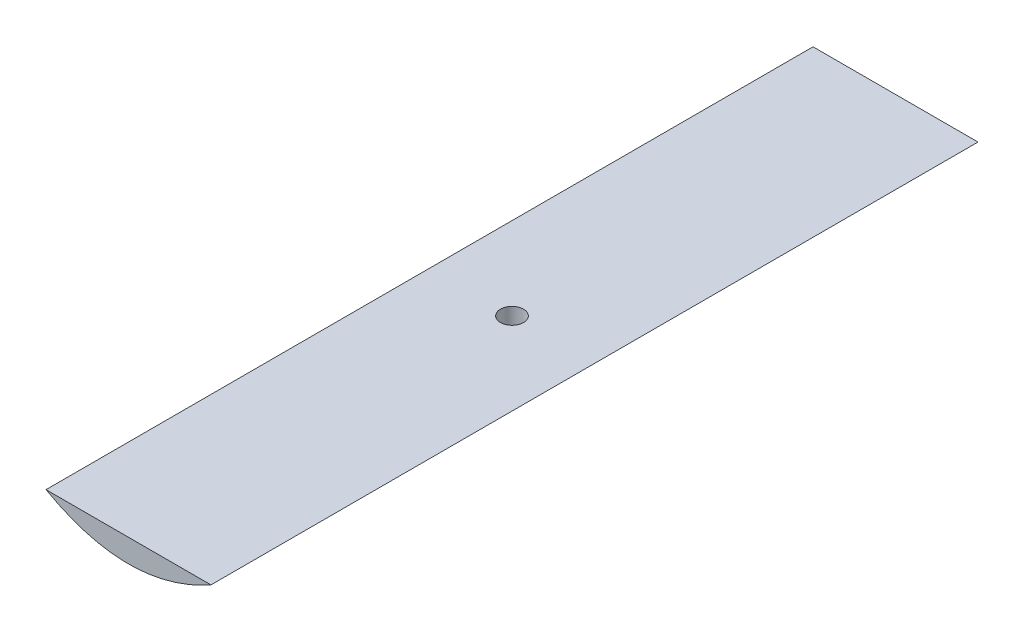
ISO-10303-21;
HEADER;
FILE_DESCRIPTION(('STEP AP214'),'2;1');
FILE_NAME('part.step','',(''),(''),'','','');
FILE_SCHEMA(('AUTOMOTIVE_DESIGN { 1 0 10303 214 1 1 1 1 }'));
ENDSEC;
DATA;
#1=APPLICATION_CONTEXT('core data for automotive mechanical design processes');
#2=APPLICATION_PROTOCOL_DEFINITION('international standard','automotive_design',2000,#1);
#3=PRODUCT_CONTEXT('',#1,'mechanical');
#4=PRODUCT('Part','Part','',(#3));
#5=PRODUCT_RELATED_PRODUCT_CATEGORY('part','',(#4));
#6=PRODUCT_DEFINITION_FORMATION('','',#4);
#7=PRODUCT_DEFINITION_CONTEXT('part definition',#1,'design');
#8=PRODUCT_DEFINITION('design','',#6,#7);
#9=PRODUCT_DEFINITION_SHAPE('','',#8);
#10=(LENGTH_UNIT() NAMED_UNIT(*) SI_UNIT(.MILLI.,.METRE.));
#11=(NAMED_UNIT(*) PLANE_ANGLE_UNIT() SI_UNIT($,.RADIAN.));
#12=(NAMED_UNIT(*) SI_UNIT($,.STERADIAN.) SOLID_ANGLE_UNIT());
#13=UNCERTAINTY_MEASURE_WITH_UNIT(LENGTH_MEASURE(1.E-05),#10,'distance_accuracy_value','');
#14=(GEOMETRIC_REPRESENTATION_CONTEXT(3) GLOBAL_UNCERTAINTY_ASSIGNED_CONTEXT((#13)) GLOBAL_UNIT_ASSIGNED_CONTEXT((#10,
#11,#12)) REPRESENTATION_CONTEXT('',''));
#15=CARTESIAN_POINT('',(0.,0.,0.));
#16=DIRECTION('',(0.,0.,1.));
#17=DIRECTION('',(1.,0.,0.));
#18=AXIS2_PLACEMENT_3D('',#15,#16,#17);
#19=CARTESIAN_POINT('',(-127.000000000214,127.000000000428,331.382));
#20=CARTESIAN_POINT('',(-3.79340656109228E-11,-127.000000000353,331.382));
#21=CARTESIAN_POINT('',(127.000000000138,127.000000000277,331.382));
#22=B_SPLINE_CURVE_WITH_KNOTS('',2,(#19,#20,#21),.UNSPECIFIED.,.F.,.F.,(3,3),
(0.0560283962320779,0.943971603767657),.UNSPECIFIED.);
#23=DIRECTION('',(0.,0.,-1.));
#24=VECTOR('',#23,1.);
#25=SURFACE_OF_LINEAR_EXTRUSION('',#22,#24);
#26=CARTESIAN_POINT('',(-3.8666986279523E-11,0.,170.691));
#27=CARTESIAN_POINT('',(0.140243418776108,-2.6699305172424E-07,170.691001231433));
#28=CARTESIAN_POINT('',(0.280467525237042,0.000465562516940687,170.685097230984));
#29=CARTESIAN_POINT('',(0.559962595063275,0.00231523587437549,170.661524046872));
#30=CARTESIAN_POINT('',(0.699233312636911,0.00369930806766296,170.643851936745));
#31=CARTESIAN_POINT('',(0.975897753678727,0.00734818817902314,170.596846553818));
#32=CARTESIAN_POINT('',(1.11328981478552,0.00961372970035764,170.56750356747));
#33=CARTESIAN_POINT('',(1.38515426852992,0.0149619507509379,170.497356400755));
#34=CARTESIAN_POINT('',(1.5196255738456,0.0180449291352847,170.456548028314));
#35=CARTESIAN_POINT('',(1.78451787567308,0.0249368185981995,170.363811791102));
#36=CARTESIAN_POINT('',(1.91494251092554,0.0287450541534105,170.311894268167));
#37=CARTESIAN_POINT('',(2.17099762711855,0.0369829254037339,170.197268116185));
#38=CARTESIAN_POINT('',(2.29662632225176,0.0414127897511894,170.134555514476));
#39=CARTESIAN_POINT('',(2.54208015035429,0.0507646918339267,169.998839784442));
#40=CARTESIAN_POINT('',(2.66190866062418,0.0556864379148631,169.925842743734));
#41=CARTESIAN_POINT('',(2.89504226039194,0.0658871980457952,169.770018962073));
#42=CARTESIAN_POINT('',(3.00834492019486,0.071166343591083,169.68718859468));
#43=CARTESIAN_POINT('',(3.22776531807338,0.0819402346027991,169.512159366714));
#44=CARTESIAN_POINT('',(3.33387079568423,0.0874353239752214,169.419945157102));
#45=CARTESIAN_POINT('',(3.53797985082088,0.0984793661946682,169.226878907786));
#46=CARTESIAN_POINT('',(3.63598042026635,0.104028338193645,169.126023689055));
#47=CARTESIAN_POINT('',(3.82311357234575,0.115019233076617,168.916450529071));
#48=CARTESIAN_POINT('',(3.91224902862397,0.120461190187785,168.807735155566));
#49=CARTESIAN_POINT('',(4.08108889468054,0.131087830094054,168.583137354757));
#50=CARTESIAN_POINT('',(4.1607898115851,0.136272417195219,168.467252297105));
#51=CARTESIAN_POINT('',(4.31022521240846,0.146239769918813,168.229058992093));
#52=CARTESIAN_POINT('',(4.37995042878405,0.151022160217652,168.106744914469));
#53=CARTESIAN_POINT('',(4.50887230569179,0.160045436635679,167.856611914746));
#54=CARTESIAN_POINT('',(4.56806506178813,0.164286121778395,167.728790972945));
#55=CARTESIAN_POINT('',(4.67544406310053,0.172101519356614,167.468643348392));
#56=CARTESIAN_POINT('',(4.72363450571177,0.175676485668325,167.336318406135));
#57=CARTESIAN_POINT('',(4.80870605794444,0.182061768738799,167.06801238023));
#58=CARTESIAN_POINT('',(4.84558299658507,0.184871803445185,166.93202996822));
#59=CARTESIAN_POINT('',(4.90765760390563,0.18963883535412,166.657751261876));
#60=CARTESIAN_POINT('',(4.9328837080034,0.191597908737746,166.519461463822));
#61=CARTESIAN_POINT('',(4.97162121814531,0.194619484385594,166.241227113128));
#62=CARTESIAN_POINT('',(4.98512829820605,0.195681655561715,166.101281968738));
#63=CARTESIAN_POINT('',(5.00785028255985,0.197465261504826,165.680568740317));
#64=CARTESIAN_POINT('',(4.99933435425245,0.196789176377217,165.398619297601));
#65=CARTESIAN_POINT('',(4.93519466446421,0.191773289877744,164.840956512123));
#66=CARTESIAN_POINT('',(4.87967550964054,0.187441624144494,164.565230716333));
#67=CARTESIAN_POINT('',(4.72329742511955,0.175617781650834,164.026982407948));
#68=CARTESIAN_POINT('',(4.62243809801755,0.168125577188474,163.764460011104));
#69=CARTESIAN_POINT('',(4.37811755304827,0.150811439286074,163.259788491915));
#70=CARTESIAN_POINT('',(4.23460933280636,0.14098693789068,163.017662227523));
#71=CARTESIAN_POINT('',(3.90910081484108,0.120115482975406,162.560891810831));
#72=CARTESIAN_POINT('',(3.72709982298985,0.109068507412754,162.346248154228));
#73=CARTESIAN_POINT('',(3.32918322893821,0.0869595663502635,161.949930081972));
#74=CARTESIAN_POINT('',(3.11317700776928,0.0758976414218899,161.768346638056));
#75=CARTESIAN_POINT('',(2.6536981102666,0.0550348333427399,161.444005182733));
#76=CARTESIAN_POINT('',(2.41022541724305,0.0452339509582345,161.301247194917));
#77=CARTESIAN_POINT('',(1.90266457040486,0.0279984114823269,161.058614480152));
#78=CARTESIAN_POINT('',(1.63857440492174,0.0205639856487961,160.958743943971));
#79=CARTESIAN_POINT('',(1.09730317990273,0.00890462123123609,160.804785603792));
#80=CARTESIAN_POINT('',(0.820122364217823,0.00467962288742488,160.750696947328));
#81=CARTESIAN_POINT('',(0.261330002917575,-7.51403248485056E-05,160.689951970638));
#82=CARTESIAN_POINT('',(-0.0202677417834046,-0.000614738160187065,160.683169432574));
#83=CARTESIAN_POINT('',(-0.580596422133503,0.00203614659788219,160.716898777606));
#84=CARTESIAN_POINT('',(-0.859327381489082,0.00522659832113232,160.757410269294));
#85=CARTESIAN_POINT('',(-1.40565044844913,0.0149707424967937,160.884472916647));
#86=CARTESIAN_POINT('',(-1.67325625214006,0.0215201587106409,160.970965539651));
#87=CARTESIAN_POINT('',(-2.19015653473811,0.0372434568118303,161.187475405468));
#88=CARTESIAN_POINT('',(-2.43945075247467,0.0464173761222406,161.317493268917));
#89=CARTESIAN_POINT('',(-2.91322808002541,0.0663825060716991,161.617683087982));
#90=CARTESIAN_POINT('',(-3.13765781918519,0.0771770828180645,161.787939051032));
#91=CARTESIAN_POINT('',(-3.55479654863162,0.0991573479486632,162.163646792544));
#92=CARTESIAN_POINT('',(-3.74750504999585,0.110343042358009,162.36909911339));
#93=CARTESIAN_POINT('',(-4.09616256899048,0.131873970029107,162.809927520824));
#94=CARTESIAN_POINT('',(-4.25202950242808,0.142217293498592,163.045368661827));
#95=CARTESIAN_POINT('',(-4.52201338280188,0.16086864532871,163.539114121048));
#96=CARTESIAN_POINT('',(-4.63613070900519,0.169176692178236,163.797418231546));
#97=CARTESIAN_POINT('',(-4.81924759478122,0.182808265057976,164.329459419444));
#98=CARTESIAN_POINT('',(-4.88829797247574,0.188135151716316,164.603178734632));
#99=CARTESIAN_POINT('',(-4.95667946438499,0.193450859053268,165.019287994346));
#100=CARTESIAN_POINT('',(-4.97360724013074,0.194776983593156,165.15898854501));
#101=CARTESIAN_POINT('',(-4.99563611124138,0.196505744824291,165.439310600866));
#102=CARTESIAN_POINT('',(-5.00074160508297,0.196908724970557,165.579931744018));
#103=CARTESIAN_POINT('',(-4.99908613476319,0.196778498611664,165.860764356471));
#104=CARTESIAN_POINT('',(-4.9923529142798,0.196247480901902,166.000976014337));
#105=CARTESIAN_POINT('',(-4.96713178478163,0.194269587875403,166.280281755162));
#106=CARTESIAN_POINT('',(-4.94864822935825,0.192823051766303,166.419376232725));
#107=CARTESIAN_POINT('',(-4.90005397006219,0.189054644695284,166.695559135993));
#108=CARTESIAN_POINT('',(-4.86993898436763,0.186732451389405,166.83264680363));
#109=CARTESIAN_POINT('',(-4.79831316837335,0.181279752096686,167.103741638904));
#110=CARTESIAN_POINT('',(-4.75680652118187,0.178149542844733,167.237749917779));
#111=CARTESIAN_POINT('',(-4.66267556826608,0.171167948629343,167.501832124425));
#112=CARTESIAN_POINT('',(-4.61004769869226,0.167316332532672,167.631904775693));
#113=CARTESIAN_POINT('',(-4.49408015230297,0.159003131731914,167.887105748433));
#114=CARTESIAN_POINT('',(-4.43074440693372,0.154541771013164,168.012235863854));
#115=CARTESIAN_POINT('',(-4.29377452107371,0.145132364420985,168.256764185106));
#116=CARTESIAN_POINT('',(-4.22013683366182,0.140184151100823,168.376160397675));
#117=CARTESIAN_POINT('',(-4.06313011081605,0.12994384602158,168.60829341564));
#118=CARTESIAN_POINT('',(-3.97976463762505,0.124651880454774,168.72103263614));
#119=CARTESIAN_POINT('',(-3.80360882238128,0.113855609181186,168.939430372674));
#120=CARTESIAN_POINT('',(-3.71079142443317,0.108350723569986,169.045067038573));
#121=CARTESIAN_POINT('',(-3.51662895713596,0.0973012660650058,169.248111922484));
#122=CARTESIAN_POINT('',(-3.41528702547247,0.0917567094547948,169.345523141868));
#123=CARTESIAN_POINT('',(-3.20469594928144,0.0807794109392042,169.531530255022));
#124=CARTESIAN_POINT('',(-3.09544200515702,0.0753467395158035,169.620120719233));
#125=CARTESIAN_POINT('',(-2.8698943461558,0.0647526218217907,169.78776005606));
#126=CARTESIAN_POINT('',(-2.75360324408777,0.0595910761991617,169.866812437803));
#127=CARTESIAN_POINT('',(-2.51451600059494,0.0496730195788078,170.015006366644));
#128=CARTESIAN_POINT('',(-2.39170682871411,0.0449173736033164,170.084126951929));
#129=CARTESIAN_POINT('',(-2.14072448719616,0.0359603178528859,170.211742374541));
#130=CARTESIAN_POINT('',(-2.01255330031871,0.0317587055529676,170.270241097615));
#131=CARTESIAN_POINT('',(-1.75182309414916,0.0240307807061436,170.376178494539));
#132=CARTESIAN_POINT('',(-1.61926789247816,0.0205038978632863,170.423626516121));
#133=CARTESIAN_POINT('',(-1.35065667957684,0.0142222909830544,170.507171734714));
#134=CARTESIAN_POINT('',(-1.21460156064564,0.011467372223445,170.543271794443));
#135=CARTESIAN_POINT('',(-0.900567784081527,0.0061405593548209,170.612554086596));
#136=CARTESIAN_POINT('',(-0.721734853520387,0.00384669906358009,170.641944324627));
#137=CARTESIAN_POINT('',(-0.361923895658573,0.000776593390433146,170.681166464188));
#138=CARTESIAN_POINT('',(-0.180945873343936,3.44481697017355E-07,170.690998411172));
#139=CARTESIAN_POINT('',(-3.8666986279523E-11,0.,170.691));
#140=B_SPLINE_CURVE_WITH_KNOTS('',3,(#26,#27,#28,#29,#30,#31,#32,#33,#34,#35,#36,#37,#38,#39,
#40,#41,#42,#43,#44,#45,#46,#47,#48,#49,#50,#51,#52,#53,#54,#55,#56,#57,#58,#59,#60,#61,#62,#63,
#64,#65,#66,#67,#68,#69,#70,#71,#72,#73,#74,#75,#76,#77,#78,#79,#80,#81,#82,#83,#84,#85,#86,#87,
#88,#89,#90,#91,#92,#93,#94,#95,#96,#97,#98,#99,#100,#101,#102,#103,#104,#105,#106,#107,#108,
#109,#110,#111,#112,#113,#114,#115,#116,#117,#118,#119,#120,#121,#122,#123,#124,#125,#126,#127,
#128,#129,#130,#131,#132,#133,#134,#135,#136,#137,#138,#139),.UNSPECIFIED.,.T.,.F.,(4,2,2,2,2,2,
2,2,2,2,2,2,2,2,2,2,2,2,2,2,2,2,2,2,2,2,2,2,2,2,2,2,2,2,2,2,2,2,2,2,2,2,2,2,2,2,2,2,2,2,2,2,2,2,
2,2,4),(0.,0.420572092113115,0.841248810058733,1.26227638788762,1.68345810624899,
2.10424942688823,2.52519593396708,2.94589431109778,3.36674832275209,3.78830213635377,
4.21001171108224,4.63158413919714,5.05331215776144,5.47542945739227,5.89770291348426,
6.31981500157106,6.74208252439412,7.16331392880732,7.5847007613269,8.42655257184845,
9.26653573388229,10.1065262584762,10.9474459723122,11.7883808514781,12.6315958646877,
13.4748113902733,14.3181092923571,15.1613914917853,16.0024228594873,16.8434472668026,
17.6834036287611,18.5233719683435,19.3651096964196,20.2068603970638,21.0504692299972,
21.8940703991216,22.7367186607014,23.1584915288086,23.5801074512068,24.0007366455998,
24.4212100843297,24.8418384576594,25.2623125791052,25.6829216484051,26.1033766231779,
26.5239767169669,26.9444232706403,27.3661091071582,27.7876404043232,28.2094295887173,
28.6310631176646,29.0535738611475,29.4759297266713,29.8979270152338,30.3198177620813,
30.8624525751247,31.4050861271186),.UNSPECIFIED.);
#141=CARTESIAN_POINT('',(-3.8666986279523E-11,0.,170.691));
#142=VERTEX_POINT('',#141);
#143=EDGE_CURVE('E67',#142,#142,#140,.T.);
#144=ORIENTED_EDGE('',*,*,#143,.T.);
#145=EDGE_LOOP('',(#144));
#146=FACE_BOUND('',#145,.T.);
#147=CARTESIAN_POINT('',(-35.6370593624671,9.99999999999999,331.382));
#148=VERTEX_POINT('',#147);
#149=CARTESIAN_POINT('',(35.6370593624671,9.99999999999999,331.382));
#150=VERTEX_POINT('',#149);
#151=EDGE_CURVE('E11',#148,#150,#22,.T.);
#152=ORIENTED_EDGE('',*,*,#151,.F.);
#153=DIRECTION('',(0.,0.,-1.));
#154=VECTOR('',#153,1.);
#155=CARTESIAN_POINT('',(-35.6370593624108,9.99999999999994,331.382));
#156=LINE('',#155,#154);
#157=CARTESIAN_POINT('',(-35.6370593624671,9.99999999999999,0.));
#158=VERTEX_POINT('',#157);
#159=EDGE_CURVE('E59',#148,#158,#156,.T.);
#160=ORIENTED_EDGE('',*,*,#159,.T.);
#161=CARTESIAN_POINT('',(-127.000000000214,127.000000000428,0.));
#162=CARTESIAN_POINT('',(-3.79340656109228E-11,-127.000000000353,0.));
#163=CARTESIAN_POINT('',(127.000000000138,127.000000000277,0.));
#164=B_SPLINE_CURVE_WITH_KNOTS('',2,(#161,#162,#163),.UNSPECIFIED.,.F.,.F.,(3,3),
(0.0560283962320779,0.943971603767657),.UNSPECIFIED.);
#165=CARTESIAN_POINT('',(35.6370593624671,10.0000000000315,0.));
#166=VERTEX_POINT('',#165);
#167=EDGE_CURVE('E43',#158,#166,#164,.T.);
#168=ORIENTED_EDGE('',*,*,#167,.T.);
#169=DIRECTION('',(0.,0.,-1.));
#170=VECTOR('',#169,1.);
#171=CARTESIAN_POINT('',(35.6370593624109,9.99999999999998,331.382));
#172=LINE('',#171,#170);
#173=EDGE_CURVE('E50',#166,#150,#172,.F.);
#174=ORIENTED_EDGE('',*,*,#173,.T.);
#175=EDGE_LOOP('',(#152,#160,#168,#174));
#176=FACE_BOUND('',#175,.T.);
#177=ADVANCED_FACE('F33',(#146,#176),#25,.F.);
#178=CARTESIAN_POINT('',(-3.79349329726608E-11,0.,331.382));
#179=DIRECTION('',(0.,0.,-1.));
#180=DIRECTION('',(-1.,0.,0.));
#181=AXIS2_PLACEMENT_3D('',#178,#179,#180);
#182=PLANE('',#181);
#183=ORIENTED_EDGE('',*,*,#151,.T.);
#184=DIRECTION('',(1.,0.,0.));
#185=VECTOR('',#184,1.);
#186=CARTESIAN_POINT('',(-130.,9.99999999999999,331.382));
#187=LINE('',#186,#185);
#188=EDGE_CURVE('E62',#148,#150,#187,.T.);
#189=ORIENTED_EDGE('',*,*,#188,.F.);
#190=EDGE_LOOP('',(#183,#189));
#191=FACE_BOUND('',#190,.T.);
#192=ADVANCED_FACE('F70',(#191),#182,.F.);
#193=CARTESIAN_POINT('',(-3.79349329726608E-11,0.,0.));
#194=DIRECTION('',(0.,0.,-1.));
#195=DIRECTION('',(-1.,0.,0.));
#196=AXIS2_PLACEMENT_3D('',#193,#194,#195);
#197=PLANE('',#196);
#198=DIRECTION('',(1.,0.,0.));
#199=VECTOR('',#198,1.);
#200=CARTESIAN_POINT('',(-130.,9.99999999999999,0.));
#201=LINE('',#200,#199);
#202=EDGE_CURVE('E54',#158,#166,#201,.T.);
#203=ORIENTED_EDGE('',*,*,#202,.T.);
#204=ORIENTED_EDGE('',*,*,#167,.F.);
#205=EDGE_LOOP('',(#203,#204));
#206=FACE_BOUND('',#205,.T.);
#207=ADVANCED_FACE('F88',(#206),#197,.T.);
#208=CARTESIAN_POINT('',(-3.86635168325711E-11,-3.79141162909491E-11,165.691));
#209=DIRECTION('',(0.,1.,0.));
#210=DIRECTION('',(0.,0.,1.));
#211=AXIS2_PLACEMENT_3D('',#208,#209,#210);
#212=CYLINDRICAL_SURFACE('',#211,5.);
#213=CARTESIAN_POINT('',(-3.86635168325711E-11,9.99999999999999,165.691));
#214=DIRECTION('',(0.,-1.,0.));
#215=DIRECTION('',(0.,0.,-1.));
#216=AXIS2_PLACEMENT_3D('',#213,#214,#215);
#217=CIRCLE('',#216,5.);
#218=CARTESIAN_POINT('',(-3.86635168325711E-11,9.99999999999999,160.691));
#219=VERTEX_POINT('',#218);
#220=EDGE_CURVE('E38',#219,#219,#217,.F.);
#221=ORIENTED_EDGE('',*,*,#220,.T.);
#222=EDGE_LOOP('',(#221));
#223=FACE_BOUND('',#222,.T.);
#224=ORIENTED_EDGE('',*,*,#143,.F.);
#225=EDGE_LOOP('',(#224));
#226=FACE_BOUND('',#225,.T.);
#227=ADVANCED_FACE('F83',(#223,#226),#212,.F.);
#228=CARTESIAN_POINT('',(-130.,9.99999999999999,0.));
#229=DIRECTION('',(0.,-1.,0.));
#230=DIRECTION('',(0.,0.,-1.));
#231=AXIS2_PLACEMENT_3D('',#228,#229,#230);
#232=PLANE('',#231);
#233=ORIENTED_EDGE('',*,*,#220,.F.);
#234=EDGE_LOOP('',(#233));
#235=FACE_BOUND('',#234,.T.);
#236=ORIENTED_EDGE('',*,*,#188,.T.);
#237=ORIENTED_EDGE('',*,*,#173,.F.);
#238=ORIENTED_EDGE('',*,*,#202,.F.);
#239=ORIENTED_EDGE('',*,*,#159,.F.);
#240=EDGE_LOOP('',(#236,#237,#238,#239));
#241=FACE_BOUND('',#240,.T.);
#242=ADVANCED_FACE('F61',(#235,#241),#232,.F.);
#243=CLOSED_SHELL('',(#177,#192,#207,#227,#242));
#244=MANIFOLD_SOLID_BREP('B2',#243);
#245=ADVANCED_BREP_SHAPE_REPRESENTATION('',(#18,#244),#14);
#246=SHAPE_DEFINITION_REPRESENTATION(#9,#245);
ENDSEC;
END-ISO-10303-21;
